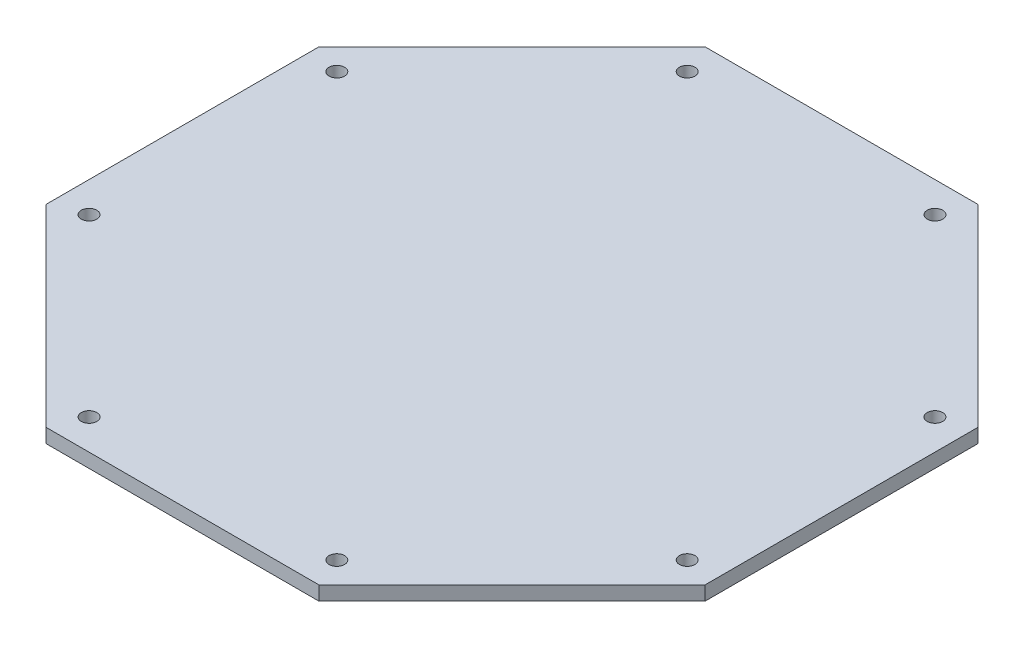
ISO-10303-21;
HEADER;
FILE_DESCRIPTION(('STEP AP214'),'2;1');
FILE_NAME('part.step','',(''),(''),'','','');
FILE_SCHEMA(('AUTOMOTIVE_DESIGN { 1 0 10303 214 1 1 1 1 }'));
ENDSEC;
DATA;
#1=APPLICATION_CONTEXT('core data for automotive mechanical design processes');
#2=APPLICATION_PROTOCOL_DEFINITION('international standard','automotive_design',2000,#1);
#3=PRODUCT_CONTEXT('',#1,'mechanical');
#4=PRODUCT('Part','Part','',(#3));
#5=PRODUCT_RELATED_PRODUCT_CATEGORY('part','',(#4));
#6=PRODUCT_DEFINITION_FORMATION('','',#4);
#7=PRODUCT_DEFINITION_CONTEXT('part definition',#1,'design');
#8=PRODUCT_DEFINITION('design','',#6,#7);
#9=PRODUCT_DEFINITION_SHAPE('','',#8);
#10=(LENGTH_UNIT() NAMED_UNIT(*) SI_UNIT(.MILLI.,.METRE.));
#11=(NAMED_UNIT(*) PLANE_ANGLE_UNIT() SI_UNIT($,.RADIAN.));
#12=(NAMED_UNIT(*) SI_UNIT($,.STERADIAN.) SOLID_ANGLE_UNIT());
#13=UNCERTAINTY_MEASURE_WITH_UNIT(LENGTH_MEASURE(1.E-05),#10,'distance_accuracy_value','');
#14=(GEOMETRIC_REPRESENTATION_CONTEXT(3) GLOBAL_UNCERTAINTY_ASSIGNED_CONTEXT((#13)) GLOBAL_UNIT_ASSIGNED_CONTEXT((#10,
#11,#12)) REPRESENTATION_CONTEXT('',''));
#15=CARTESIAN_POINT('',(0.,0.,0.));
#16=DIRECTION('',(0.,0.,1.));
#17=DIRECTION('',(1.,0.,0.));
#18=AXIS2_PLACEMENT_3D('',#15,#16,#17);
#19=CARTESIAN_POINT('',(70.,1.5,28.9949493661166));
#20=DIRECTION('',(-1.,0.,0.));
#21=DIRECTION('',(0.,0.,1.));
#22=AXIS2_PLACEMENT_3D('',#19,#20,#21);
#23=PLANE('',#22);
#24=DIRECTION('',(0.,0.,-1.));
#25=VECTOR('',#24,1.);
#26=CARTESIAN_POINT('',(70.,-1.5,28.9949493661166));
#27=LINE('',#26,#25);
#28=CARTESIAN_POINT('',(70.,-1.5,28.9949493661166));
#29=VERTEX_POINT('',#28);
#30=CARTESIAN_POINT('',(70.,-1.5,-28.9949493661166));
#31=VERTEX_POINT('',#30);
#32=EDGE_CURVE('E139',#29,#31,#27,.T.);
#33=ORIENTED_EDGE('',*,*,#32,.T.);
#34=DIRECTION('',(0.,-1.,0.));
#35=VECTOR('',#34,1.);
#36=CARTESIAN_POINT('',(70.,1.5,-28.9949493661166));
#37=LINE('',#36,#35);
#38=CARTESIAN_POINT('',(70.,1.5,-28.9949493661166));
#39=VERTEX_POINT('',#38);
#40=EDGE_CURVE('E11',#39,#31,#37,.T.);
#41=ORIENTED_EDGE('',*,*,#40,.F.);
#42=DIRECTION('',(0.,0.,-1.));
#43=VECTOR('',#42,1.);
#44=CARTESIAN_POINT('',(70.,1.5,28.9949493661166));
#45=LINE('',#44,#43);
#46=CARTESIAN_POINT('',(70.,1.5,28.9949493661166));
#47=VERTEX_POINT('',#46);
#48=EDGE_CURVE('E154',#47,#39,#45,.T.);
#49=ORIENTED_EDGE('',*,*,#48,.F.);
#50=DIRECTION('',(0.,-1.,0.));
#51=VECTOR('',#50,1.);
#52=CARTESIAN_POINT('',(70.,1.5,28.9949493661166));
#53=LINE('',#52,#51);
#54=EDGE_CURVE('E135',#47,#29,#53,.T.);
#55=ORIENTED_EDGE('',*,*,#54,.T.);
#56=EDGE_LOOP('',(#33,#41,#49,#55));
#57=FACE_BOUND('',#56,.T.);
#58=ADVANCED_FACE('F43',(#57),#23,.F.);
#59=CARTESIAN_POINT('',(70.,1.5,-28.9949493661166));
#60=DIRECTION('',(-0.707106781186547,0.,0.707106781186547));
#61=DIRECTION('',(0.707106781186548,0.,0.707106781186548));
#62=AXIS2_PLACEMENT_3D('',#59,#60,#61);
#63=PLANE('',#62);
#64=DIRECTION('',(-0.707106781186548,0.,-0.707106781186548));
#65=VECTOR('',#64,1.);
#66=CARTESIAN_POINT('',(70.,-1.5,-28.9949493661166));
#67=LINE('',#66,#65);
#68=CARTESIAN_POINT('',(28.9949493661166,-1.5,-70.));
#69=VERTEX_POINT('',#68);
#70=EDGE_CURVE('E142',#31,#69,#67,.T.);
#71=ORIENTED_EDGE('',*,*,#70,.T.);
#72=DIRECTION('',(0.,-1.,0.));
#73=VECTOR('',#72,1.);
#74=CARTESIAN_POINT('',(28.9949493661166,1.5,-70.));
#75=LINE('',#74,#73);
#76=CARTESIAN_POINT('',(28.9949493661166,1.5,-70.));
#77=VERTEX_POINT('',#76);
#78=EDGE_CURVE('E51',#77,#69,#75,.T.);
#79=ORIENTED_EDGE('',*,*,#78,.F.);
#80=DIRECTION('',(-0.707106781186548,0.,-0.707106781186548));
#81=VECTOR('',#80,1.);
#82=CARTESIAN_POINT('',(70.,1.5,-28.9949493661166));
#83=LINE('',#82,#81);
#84=EDGE_CURVE('E102',#39,#77,#83,.T.);
#85=ORIENTED_EDGE('',*,*,#84,.F.);
#86=ORIENTED_EDGE('',*,*,#40,.T.);
#87=EDGE_LOOP('',(#71,#79,#85,#86));
#88=FACE_BOUND('',#87,.T.);
#89=ADVANCED_FACE('F257',(#88),#63,.F.);
#90=CARTESIAN_POINT('',(28.9949493661166,1.5,-70.));
#91=DIRECTION('',(0.,0.,1.));
#92=DIRECTION('',(1.,0.,0.));
#93=AXIS2_PLACEMENT_3D('',#90,#91,#92);
#94=PLANE('',#93);
#95=DIRECTION('',(-1.,0.,0.));
#96=VECTOR('',#95,1.);
#97=CARTESIAN_POINT('',(28.9949493661166,-1.5,-70.));
#98=LINE('',#97,#96);
#99=CARTESIAN_POINT('',(-28.9949493661167,-1.5,-70.));
#100=VERTEX_POINT('',#99);
#101=EDGE_CURVE('E145',#69,#100,#98,.T.);
#102=ORIENTED_EDGE('',*,*,#101,.T.);
#103=DIRECTION('',(0.,-1.,0.));
#104=VECTOR('',#103,1.);
#105=CARTESIAN_POINT('',(-28.9949493661167,1.5,-70.));
#106=LINE('',#105,#104);
#107=CARTESIAN_POINT('',(-28.9949493661167,1.5,-70.));
#108=VERTEX_POINT('',#107);
#109=EDGE_CURVE('E161',#108,#100,#106,.T.);
#110=ORIENTED_EDGE('',*,*,#109,.F.);
#111=DIRECTION('',(-1.,0.,0.));
#112=VECTOR('',#111,1.);
#113=CARTESIAN_POINT('',(28.9949493661166,1.5,-70.));
#114=LINE('',#113,#112);
#115=EDGE_CURVE('E169',#77,#108,#114,.T.);
#116=ORIENTED_EDGE('',*,*,#115,.F.);
#117=ORIENTED_EDGE('',*,*,#78,.T.);
#118=EDGE_LOOP('',(#102,#110,#116,#117));
#119=FACE_BOUND('',#118,.T.);
#120=ADVANCED_FACE('F167',(#119),#94,.F.);
#121=CARTESIAN_POINT('',(-28.9949493661167,1.5,-70.));
#122=DIRECTION('',(0.707106781186547,0.,0.707106781186547));
#123=DIRECTION('',(0.707106781186548,0.,-0.707106781186548));
#124=AXIS2_PLACEMENT_3D('',#121,#122,#123);
#125=PLANE('',#124);
#126=DIRECTION('',(-0.707106781186548,0.,0.707106781186548));
#127=VECTOR('',#126,1.);
#128=CARTESIAN_POINT('',(-28.9949493661167,-1.5,-70.));
#129=LINE('',#128,#127);
#130=CARTESIAN_POINT('',(-70.,-1.5,-28.9949493661166));
#131=VERTEX_POINT('',#130);
#132=EDGE_CURVE('E147',#100,#131,#129,.T.);
#133=ORIENTED_EDGE('',*,*,#132,.T.);
#134=DIRECTION('',(0.,-1.,0.));
#135=VECTOR('',#134,1.);
#136=CARTESIAN_POINT('',(-70.,1.5,-28.9949493661166));
#137=LINE('',#136,#135);
#138=CARTESIAN_POINT('',(-70.,1.5,-28.9949493661166));
#139=VERTEX_POINT('',#138);
#140=EDGE_CURVE('E158',#139,#131,#137,.T.);
#141=ORIENTED_EDGE('',*,*,#140,.F.);
#142=DIRECTION('',(-0.707106781186548,0.,0.707106781186548));
#143=VECTOR('',#142,1.);
#144=CARTESIAN_POINT('',(-28.9949493661167,1.5,-70.));
#145=LINE('',#144,#143);
#146=EDGE_CURVE('E181',#108,#139,#145,.T.);
#147=ORIENTED_EDGE('',*,*,#146,.F.);
#148=ORIENTED_EDGE('',*,*,#109,.T.);
#149=EDGE_LOOP('',(#133,#141,#147,#148));
#150=FACE_BOUND('',#149,.T.);
#151=ADVANCED_FACE('F177',(#150),#125,.F.);
#152=CARTESIAN_POINT('',(-70.,1.5,-28.9949493661166));
#153=DIRECTION('',(1.,0.,0.));
#154=DIRECTION('',(0.,0.,-1.));
#155=AXIS2_PLACEMENT_3D('',#152,#153,#154);
#156=PLANE('',#155);
#157=DIRECTION('',(0.,0.,1.));
#158=VECTOR('',#157,1.);
#159=CARTESIAN_POINT('',(-70.,-1.5,-28.9949493661166));
#160=LINE('',#159,#158);
#161=CARTESIAN_POINT('',(-70.,-1.5,28.9949493661167));
#162=VERTEX_POINT('',#161);
#163=EDGE_CURVE('E149',#131,#162,#160,.T.);
#164=ORIENTED_EDGE('',*,*,#163,.T.);
#165=DIRECTION('',(0.,-1.,0.));
#166=VECTOR('',#165,1.);
#167=CARTESIAN_POINT('',(-70.,1.5,28.9949493661167));
#168=LINE('',#167,#166);
#169=CARTESIAN_POINT('',(-70.,1.5,28.9949493661167));
#170=VERTEX_POINT('',#169);
#171=EDGE_CURVE('E130',#170,#162,#168,.T.);
#172=ORIENTED_EDGE('',*,*,#171,.F.);
#173=DIRECTION('',(0.,0.,1.));
#174=VECTOR('',#173,1.);
#175=CARTESIAN_POINT('',(-70.,1.5,-28.9949493661166));
#176=LINE('',#175,#174);
#177=EDGE_CURVE('E121',#139,#170,#176,.T.);
#178=ORIENTED_EDGE('',*,*,#177,.F.);
#179=ORIENTED_EDGE('',*,*,#140,.T.);
#180=EDGE_LOOP('',(#164,#172,#178,#179));
#181=FACE_BOUND('',#180,.T.);
#182=ADVANCED_FACE('F180',(#181),#156,.F.);
#183=CARTESIAN_POINT('',(-70.,1.5,28.9949493661167));
#184=DIRECTION('',(0.707106781186547,0.,-0.707106781186548));
#185=DIRECTION('',(-0.707106781186548,0.,-0.707106781186547));
#186=AXIS2_PLACEMENT_3D('',#183,#184,#185);
#187=PLANE('',#186);
#188=DIRECTION('',(0.707106781186548,0.,0.707106781186547));
#189=VECTOR('',#188,1.);
#190=CARTESIAN_POINT('',(-70.,-1.5,28.9949493661167));
#191=LINE('',#190,#189);
#192=CARTESIAN_POINT('',(-28.9949493661167,-1.5,70.));
#193=VERTEX_POINT('',#192);
#194=EDGE_CURVE('E129',#162,#193,#191,.T.);
#195=ORIENTED_EDGE('',*,*,#194,.T.);
#196=DIRECTION('',(0.,-1.,0.));
#197=VECTOR('',#196,1.);
#198=CARTESIAN_POINT('',(-28.9949493661167,1.5,70.));
#199=LINE('',#198,#197);
#200=CARTESIAN_POINT('',(-28.9949493661167,1.5,70.));
#201=VERTEX_POINT('',#200);
#202=EDGE_CURVE('E126',#201,#193,#199,.T.);
#203=ORIENTED_EDGE('',*,*,#202,.F.);
#204=DIRECTION('',(0.707106781186548,0.,0.707106781186547));
#205=VECTOR('',#204,1.);
#206=CARTESIAN_POINT('',(-70.,1.5,28.9949493661167));
#207=LINE('',#206,#205);
#208=EDGE_CURVE('E115',#170,#201,#207,.T.);
#209=ORIENTED_EDGE('',*,*,#208,.F.);
#210=ORIENTED_EDGE('',*,*,#171,.T.);
#211=EDGE_LOOP('',(#195,#203,#209,#210));
#212=FACE_BOUND('',#211,.T.);
#213=ADVANCED_FACE('F127',(#212),#187,.F.);
#214=CARTESIAN_POINT('',(-28.9949493661167,1.5,70.));
#215=DIRECTION('',(0.,0.,-1.));
#216=DIRECTION('',(-1.,0.,0.));
#217=AXIS2_PLACEMENT_3D('',#214,#215,#216);
#218=PLANE('',#217);
#219=DIRECTION('',(1.,0.,0.));
#220=VECTOR('',#219,1.);
#221=CARTESIAN_POINT('',(-28.9949493661167,-1.5,70.));
#222=LINE('',#221,#220);
#223=CARTESIAN_POINT('',(28.9949493661166,-1.5,70.));
#224=VERTEX_POINT('',#223);
#225=EDGE_CURVE('E88',#193,#224,#222,.T.);
#226=ORIENTED_EDGE('',*,*,#225,.T.);
#227=DIRECTION('',(0.,-1.,0.));
#228=VECTOR('',#227,1.);
#229=CARTESIAN_POINT('',(28.9949493661166,1.5,70.));
#230=LINE('',#229,#228);
#231=CARTESIAN_POINT('',(28.9949493661166,1.5,70.));
#232=VERTEX_POINT('',#231);
#233=EDGE_CURVE('E131',#232,#224,#230,.T.);
#234=ORIENTED_EDGE('',*,*,#233,.F.);
#235=DIRECTION('',(1.,0.,0.));
#236=VECTOR('',#235,1.);
#237=CARTESIAN_POINT('',(-28.9949493661167,1.5,70.));
#238=LINE('',#237,#236);
#239=EDGE_CURVE('E119',#201,#232,#238,.T.);
#240=ORIENTED_EDGE('',*,*,#239,.F.);
#241=ORIENTED_EDGE('',*,*,#202,.T.);
#242=EDGE_LOOP('',(#226,#234,#240,#241));
#243=FACE_BOUND('',#242,.T.);
#244=ADVANCED_FACE('F133',(#243),#218,.F.);
#245=CARTESIAN_POINT('',(28.9949493661166,1.5,70.));
#246=DIRECTION('',(-0.707106781186547,0.,-0.707106781186548));
#247=DIRECTION('',(-0.707106781186548,0.,0.707106781186547));
#248=AXIS2_PLACEMENT_3D('',#245,#246,#247);
#249=PLANE('',#248);
#250=DIRECTION('',(0.707106781186548,0.,-0.707106781186547));
#251=VECTOR('',#250,1.);
#252=CARTESIAN_POINT('',(28.9949493661166,-1.5,70.));
#253=LINE('',#252,#251);
#254=EDGE_CURVE('E94',#224,#29,#253,.T.);
#255=ORIENTED_EDGE('',*,*,#254,.T.);
#256=ORIENTED_EDGE('',*,*,#54,.F.);
#257=DIRECTION('',(0.707106781186548,0.,-0.707106781186547));
#258=VECTOR('',#257,1.);
#259=CARTESIAN_POINT('',(28.9949493661166,1.5,70.));
#260=LINE('',#259,#258);
#261=EDGE_CURVE('E59',#232,#47,#260,.T.);
#262=ORIENTED_EDGE('',*,*,#261,.F.);
#263=ORIENTED_EDGE('',*,*,#233,.T.);
#264=EDGE_LOOP('',(#255,#256,#262,#263));
#265=FACE_BOUND('',#264,.T.);
#266=ADVANCED_FACE('F264',(#265),#249,.F.);
#267=CARTESIAN_POINT('',(0.,1.5,0.));
#268=DIRECTION('',(0.,1.,0.));
#269=DIRECTION('',(0.,0.,1.));
#270=AXIS2_PLACEMENT_3D('',#267,#268,#269);
#271=PLANE('',#270);
#272=CARTESIAN_POINT('',(-26.316165339561,1.5,-63.532843272421));
#273=DIRECTION('',(0.,-1.,0.));
#274=DIRECTION('',(0.,0.,-1.));
#275=AXIS2_PLACEMENT_3D('',#272,#273,#274);
#276=CIRCLE('',#275,1.64999999999999);
#277=CARTESIAN_POINT('',(-26.316165339561,1.5,-65.182843272421));
#278=VERTEX_POINT('',#277);
#279=EDGE_CURVE('E200',#278,#278,#276,.T.);
#280=ORIENTED_EDGE('',*,*,#279,.T.);
#281=EDGE_LOOP('',(#280));
#282=FACE_BOUND('',#281,.T.);
#283=CARTESIAN_POINT('',(-63.532843272421,1.5,26.316165339561));
#284=DIRECTION('',(0.,-1.,0.));
#285=DIRECTION('',(0.,0.,-1.));
#286=AXIS2_PLACEMENT_3D('',#283,#284,#285);
#287=CIRCLE('',#286,1.65);
#288=CARTESIAN_POINT('',(-63.532843272421,1.5,24.666165339561));
#289=VERTEX_POINT('',#288);
#290=EDGE_CURVE('E193',#289,#289,#287,.T.);
#291=ORIENTED_EDGE('',*,*,#290,.T.);
#292=EDGE_LOOP('',(#291));
#293=FACE_BOUND('',#292,.T.);
#294=CARTESIAN_POINT('',(-63.532843272421,1.5,-26.316165339561));
#295=DIRECTION('',(0.,-1.,0.));
#296=DIRECTION('',(0.,0.,-1.));
#297=AXIS2_PLACEMENT_3D('',#294,#295,#296);
#298=CIRCLE('',#297,1.65);
#299=CARTESIAN_POINT('',(-63.532843272421,1.5,-27.966165339561));
#300=VERTEX_POINT('',#299);
#301=EDGE_CURVE('E207',#300,#300,#298,.T.);
#302=ORIENTED_EDGE('',*,*,#301,.T.);
#303=EDGE_LOOP('',(#302));
#304=FACE_BOUND('',#303,.T.);
#305=CARTESIAN_POINT('',(26.3161653395609,1.5,-63.532843272421));
#306=DIRECTION('',(0.,-1.,0.));
#307=DIRECTION('',(0.,0.,-1.));
#308=AXIS2_PLACEMENT_3D('',#305,#306,#307);
#309=CIRCLE('',#308,1.65);
#310=CARTESIAN_POINT('',(26.3161653395609,1.5,-65.182843272421));
#311=VERTEX_POINT('',#310);
#312=EDGE_CURVE('E206',#311,#311,#309,.T.);
#313=ORIENTED_EDGE('',*,*,#312,.T.);
#314=EDGE_LOOP('',(#313));
#315=FACE_BOUND('',#314,.T.);
#316=CARTESIAN_POINT('',(63.532843272421,1.5,-26.316165339561));
#317=DIRECTION('',(0.,-1.,0.));
#318=DIRECTION('',(0.,0.,-1.));
#319=AXIS2_PLACEMENT_3D('',#316,#317,#318);
#320=CIRCLE('',#319,1.65);
#321=CARTESIAN_POINT('',(63.532843272421,1.5,-27.9661653395611));
#322=VERTEX_POINT('',#321);
#323=EDGE_CURVE('E217',#322,#322,#320,.T.);
#324=ORIENTED_EDGE('',*,*,#323,.T.);
#325=EDGE_LOOP('',(#324));
#326=FACE_BOUND('',#325,.T.);
#327=CARTESIAN_POINT('',(63.532843272421,1.5,26.316165339561));
#328=DIRECTION('',(0.,-1.,0.));
#329=DIRECTION('',(0.,0.,-1.));
#330=AXIS2_PLACEMENT_3D('',#327,#328,#329);
#331=CIRCLE('',#330,1.65000000000001);
#332=CARTESIAN_POINT('',(63.532843272421,1.5,24.666165339561));
#333=VERTEX_POINT('',#332);
#334=EDGE_CURVE('E223',#333,#333,#331,.T.);
#335=ORIENTED_EDGE('',*,*,#334,.T.);
#336=EDGE_LOOP('',(#335));
#337=FACE_BOUND('',#336,.T.);
#338=CARTESIAN_POINT('',(26.316165339561,1.5,63.532843272421));
#339=DIRECTION('',(0.,-1.,0.));
#340=DIRECTION('',(0.,0.,-1.));
#341=AXIS2_PLACEMENT_3D('',#338,#339,#340);
#342=CIRCLE('',#341,1.65);
#343=CARTESIAN_POINT('',(26.316165339561,1.5,61.882843272421));
#344=VERTEX_POINT('',#343);
#345=EDGE_CURVE('E229',#344,#344,#342,.T.);
#346=ORIENTED_EDGE('',*,*,#345,.T.);
#347=EDGE_LOOP('',(#346));
#348=FACE_BOUND('',#347,.T.);
#349=CARTESIAN_POINT('',(-26.316165339561,1.5,63.532843272421));
#350=DIRECTION('',(0.,-1.,0.));
#351=DIRECTION('',(0.,0.,-1.));
#352=AXIS2_PLACEMENT_3D('',#349,#350,#351);
#353=CIRCLE('',#352,1.65);
#354=CARTESIAN_POINT('',(-26.316165339561,1.5,61.882843272421));
#355=VERTEX_POINT('',#354);
#356=EDGE_CURVE('E143',#355,#355,#353,.T.);
#357=ORIENTED_EDGE('',*,*,#356,.T.);
#358=EDGE_LOOP('',(#357));
#359=FACE_BOUND('',#358,.T.);
#360=ORIENTED_EDGE('',*,*,#48,.T.);
#361=ORIENTED_EDGE('',*,*,#84,.T.);
#362=ORIENTED_EDGE('',*,*,#115,.T.);
#363=ORIENTED_EDGE('',*,*,#146,.T.);
#364=ORIENTED_EDGE('',*,*,#177,.T.);
#365=ORIENTED_EDGE('',*,*,#208,.T.);
#366=ORIENTED_EDGE('',*,*,#239,.T.);
#367=ORIENTED_EDGE('',*,*,#261,.T.);
#368=EDGE_LOOP('',(#360,#361,#362,#363,#364,#365,#366,#367));
#369=FACE_BOUND('',#368,.T.);
#370=ADVANCED_FACE('F117',(#282,#293,#304,#315,#326,#337,#348,#359,#369),#271,.T.);
#371=CARTESIAN_POINT('',(0.,-1.5,0.));
#372=DIRECTION('',(0.,1.,0.));
#373=DIRECTION('',(0.,0.,1.));
#374=AXIS2_PLACEMENT_3D('',#371,#372,#373);
#375=PLANE('',#374);
#376=CARTESIAN_POINT('',(-26.316165339561,-1.5,-63.532843272421));
#377=DIRECTION('',(0.,-1.,0.));
#378=DIRECTION('',(0.,0.,-1.));
#379=AXIS2_PLACEMENT_3D('',#376,#377,#378);
#380=CIRCLE('',#379,1.64999999999999);
#381=CARTESIAN_POINT('',(-26.316165339561,-1.5,-65.182843272421));
#382=VERTEX_POINT('',#381);
#383=EDGE_CURVE('E203',#382,#382,#380,.T.);
#384=ORIENTED_EDGE('',*,*,#383,.F.);
#385=EDGE_LOOP('',(#384));
#386=FACE_BOUND('',#385,.T.);
#387=CARTESIAN_POINT('',(-63.532843272421,-1.5,26.316165339561));
#388=DIRECTION('',(0.,-1.,0.));
#389=DIRECTION('',(0.,0.,-1.));
#390=AXIS2_PLACEMENT_3D('',#387,#388,#389);
#391=CIRCLE('',#390,1.65);
#392=CARTESIAN_POINT('',(-63.532843272421,-1.5,24.666165339561));
#393=VERTEX_POINT('',#392);
#394=EDGE_CURVE('E196',#393,#393,#391,.T.);
#395=ORIENTED_EDGE('',*,*,#394,.F.);
#396=EDGE_LOOP('',(#395));
#397=FACE_BOUND('',#396,.T.);
#398=CARTESIAN_POINT('',(-63.532843272421,-1.5,-26.316165339561));
#399=DIRECTION('',(0.,-1.,0.));
#400=DIRECTION('',(0.,0.,-1.));
#401=AXIS2_PLACEMENT_3D('',#398,#399,#400);
#402=CIRCLE('',#401,1.65);
#403=CARTESIAN_POINT('',(-63.532843272421,-1.5,-27.966165339561));
#404=VERTEX_POINT('',#403);
#405=EDGE_CURVE('E197',#404,#404,#402,.T.);
#406=ORIENTED_EDGE('',*,*,#405,.F.);
#407=EDGE_LOOP('',(#406));
#408=FACE_BOUND('',#407,.T.);
#409=CARTESIAN_POINT('',(26.3161653395609,-1.5,-63.532843272421));
#410=DIRECTION('',(0.,-1.,0.));
#411=DIRECTION('',(0.,0.,-1.));
#412=AXIS2_PLACEMENT_3D('',#409,#410,#411);
#413=CIRCLE('',#412,1.65);
#414=CARTESIAN_POINT('',(26.3161653395609,-1.5,-65.182843272421));
#415=VERTEX_POINT('',#414);
#416=EDGE_CURVE('E214',#415,#415,#413,.T.);
#417=ORIENTED_EDGE('',*,*,#416,.F.);
#418=EDGE_LOOP('',(#417));
#419=FACE_BOUND('',#418,.T.);
#420=CARTESIAN_POINT('',(63.532843272421,-1.5,-26.316165339561));
#421=DIRECTION('',(0.,-1.,0.));
#422=DIRECTION('',(0.,0.,-1.));
#423=AXIS2_PLACEMENT_3D('',#420,#421,#422);
#424=CIRCLE('',#423,1.65);
#425=CARTESIAN_POINT('',(63.532843272421,-1.5,-27.9661653395611));
#426=VERTEX_POINT('',#425);
#427=EDGE_CURVE('E220',#426,#426,#424,.T.);
#428=ORIENTED_EDGE('',*,*,#427,.F.);
#429=EDGE_LOOP('',(#428));
#430=FACE_BOUND('',#429,.T.);
#431=CARTESIAN_POINT('',(63.532843272421,-1.5,26.316165339561));
#432=DIRECTION('',(0.,-1.,0.));
#433=DIRECTION('',(0.,0.,-1.));
#434=AXIS2_PLACEMENT_3D('',#431,#432,#433);
#435=CIRCLE('',#434,1.65000000000001);
#436=CARTESIAN_POINT('',(63.532843272421,-1.5,24.666165339561));
#437=VERTEX_POINT('',#436);
#438=EDGE_CURVE('E226',#437,#437,#435,.T.);
#439=ORIENTED_EDGE('',*,*,#438,.F.);
#440=EDGE_LOOP('',(#439));
#441=FACE_BOUND('',#440,.T.);
#442=CARTESIAN_POINT('',(26.316165339561,-1.5,63.532843272421));
#443=DIRECTION('',(0.,-1.,0.));
#444=DIRECTION('',(0.,0.,-1.));
#445=AXIS2_PLACEMENT_3D('',#442,#443,#444);
#446=CIRCLE('',#445,1.65);
#447=CARTESIAN_POINT('',(26.316165339561,-1.5,61.882843272421));
#448=VERTEX_POINT('',#447);
#449=EDGE_CURVE('E190',#448,#448,#446,.T.);
#450=ORIENTED_EDGE('',*,*,#449,.F.);
#451=EDGE_LOOP('',(#450));
#452=FACE_BOUND('',#451,.T.);
#453=CARTESIAN_POINT('',(-26.316165339561,-1.5,63.532843272421));
#454=DIRECTION('',(0.,-1.,0.));
#455=DIRECTION('',(0.,0.,-1.));
#456=AXIS2_PLACEMENT_3D('',#453,#454,#455);
#457=CIRCLE('',#456,1.65);
#458=CARTESIAN_POINT('',(-26.316165339561,-1.5,61.882843272421));
#459=VERTEX_POINT('',#458);
#460=EDGE_CURVE('E187',#459,#459,#457,.T.);
#461=ORIENTED_EDGE('',*,*,#460,.F.);
#462=EDGE_LOOP('',(#461));
#463=FACE_BOUND('',#462,.T.);
#464=ORIENTED_EDGE('',*,*,#32,.F.);
#465=ORIENTED_EDGE('',*,*,#254,.F.);
#466=ORIENTED_EDGE('',*,*,#225,.F.);
#467=ORIENTED_EDGE('',*,*,#194,.F.);
#468=ORIENTED_EDGE('',*,*,#163,.F.);
#469=ORIENTED_EDGE('',*,*,#132,.F.);
#470=ORIENTED_EDGE('',*,*,#101,.F.);
#471=ORIENTED_EDGE('',*,*,#70,.F.);
#472=EDGE_LOOP('',(#464,#465,#466,#467,#468,#469,#470,#471));
#473=FACE_BOUND('',#472,.T.);
#474=ADVANCED_FACE('F173',(#386,#397,#408,#419,#430,#441,#452,#463,#473),#375,.F.);
#475=CARTESIAN_POINT('',(-26.316165339561,1.5,63.532843272421));
#476=DIRECTION('',(0.,-1.,0.));
#477=DIRECTION('',(0.,0.,-1.));
#478=AXIS2_PLACEMENT_3D('',#475,#476,#477);
#479=CYLINDRICAL_SURFACE('',#478,1.65);
#480=ORIENTED_EDGE('',*,*,#356,.F.);
#481=EDGE_LOOP('',(#480));
#482=FACE_BOUND('',#481,.T.);
#483=ORIENTED_EDGE('',*,*,#460,.T.);
#484=EDGE_LOOP('',(#483));
#485=FACE_BOUND('',#484,.T.);
#486=ADVANCED_FACE('F239',(#482,#485),#479,.F.);
#487=CARTESIAN_POINT('',(26.316165339561,1.5,63.532843272421));
#488=DIRECTION('',(0.,-1.,0.));
#489=DIRECTION('',(0.,0.,-1.));
#490=AXIS2_PLACEMENT_3D('',#487,#488,#489);
#491=CYLINDRICAL_SURFACE('',#490,1.65);
#492=ORIENTED_EDGE('',*,*,#345,.F.);
#493=EDGE_LOOP('',(#492));
#494=FACE_BOUND('',#493,.T.);
#495=ORIENTED_EDGE('',*,*,#449,.T.);
#496=EDGE_LOOP('',(#495));
#497=FACE_BOUND('',#496,.T.);
#498=ADVANCED_FACE('F235',(#494,#497),#491,.F.);
#499=CARTESIAN_POINT('',(63.532843272421,1.5,26.316165339561));
#500=DIRECTION('',(0.,-1.,0.));
#501=DIRECTION('',(0.,0.,-1.));
#502=AXIS2_PLACEMENT_3D('',#499,#500,#501);
#503=CYLINDRICAL_SURFACE('',#502,1.65000000000001);
#504=ORIENTED_EDGE('',*,*,#334,.F.);
#505=EDGE_LOOP('',(#504));
#506=FACE_BOUND('',#505,.T.);
#507=ORIENTED_EDGE('',*,*,#438,.T.);
#508=EDGE_LOOP('',(#507));
#509=FACE_BOUND('',#508,.T.);
#510=ADVANCED_FACE('F250',(#506,#509),#503,.F.);
#511=CARTESIAN_POINT('',(63.532843272421,1.5,-26.316165339561));
#512=DIRECTION('',(0.,-1.,0.));
#513=DIRECTION('',(0.,0.,-1.));
#514=AXIS2_PLACEMENT_3D('',#511,#512,#513);
#515=CYLINDRICAL_SURFACE('',#514,1.65);
#516=ORIENTED_EDGE('',*,*,#323,.F.);
#517=EDGE_LOOP('',(#516));
#518=FACE_BOUND('',#517,.T.);
#519=ORIENTED_EDGE('',*,*,#427,.T.);
#520=EDGE_LOOP('',(#519));
#521=FACE_BOUND('',#520,.T.);
#522=ADVANCED_FACE('F341',(#518,#521),#515,.F.);
#523=CARTESIAN_POINT('',(26.3161653395609,1.5,-63.532843272421));
#524=DIRECTION('',(0.,-1.,0.));
#525=DIRECTION('',(0.,0.,-1.));
#526=AXIS2_PLACEMENT_3D('',#523,#524,#525);
#527=CYLINDRICAL_SURFACE('',#526,1.65);
#528=ORIENTED_EDGE('',*,*,#312,.F.);
#529=EDGE_LOOP('',(#528));
#530=FACE_BOUND('',#529,.T.);
#531=ORIENTED_EDGE('',*,*,#416,.T.);
#532=EDGE_LOOP('',(#531));
#533=FACE_BOUND('',#532,.T.);
#534=ADVANCED_FACE('F351',(#530,#533),#527,.F.);
#535=CARTESIAN_POINT('',(-63.532843272421,1.5,-26.316165339561));
#536=DIRECTION('',(0.,-1.,0.));
#537=DIRECTION('',(0.,0.,-1.));
#538=AXIS2_PLACEMENT_3D('',#535,#536,#537);
#539=CYLINDRICAL_SURFACE('',#538,1.65);
#540=ORIENTED_EDGE('',*,*,#301,.F.);
#541=EDGE_LOOP('',(#540));
#542=FACE_BOUND('',#541,.T.);
#543=ORIENTED_EDGE('',*,*,#405,.T.);
#544=EDGE_LOOP('',(#543));
#545=FACE_BOUND('',#544,.T.);
#546=ADVANCED_FACE('F361',(#542,#545),#539,.F.);
#547=CARTESIAN_POINT('',(-63.532843272421,1.5,26.316165339561));
#548=DIRECTION('',(0.,-1.,0.));
#549=DIRECTION('',(0.,0.,-1.));
#550=AXIS2_PLACEMENT_3D('',#547,#548,#549);
#551=CYLINDRICAL_SURFACE('',#550,1.65);
#552=ORIENTED_EDGE('',*,*,#290,.F.);
#553=EDGE_LOOP('',(#552));
#554=FACE_BOUND('',#553,.T.);
#555=ORIENTED_EDGE('',*,*,#394,.T.);
#556=EDGE_LOOP('',(#555));
#557=FACE_BOUND('',#556,.T.);
#558=ADVANCED_FACE('F371',(#554,#557),#551,.F.);
#559=CARTESIAN_POINT('',(-26.316165339561,1.5,-63.532843272421));
#560=DIRECTION('',(0.,-1.,0.));
#561=DIRECTION('',(0.,0.,-1.));
#562=AXIS2_PLACEMENT_3D('',#559,#560,#561);
#563=CYLINDRICAL_SURFACE('',#562,1.64999999999999);
#564=ORIENTED_EDGE('',*,*,#279,.F.);
#565=EDGE_LOOP('',(#564));
#566=FACE_BOUND('',#565,.T.);
#567=ORIENTED_EDGE('',*,*,#383,.T.);
#568=EDGE_LOOP('',(#567));
#569=FACE_BOUND('',#568,.T.);
#570=ADVANCED_FACE('F381',(#566,#569),#563,.F.);
#571=CLOSED_SHELL('',(#58,#89,#120,#151,#182,#213,#244,#266,#370,#474,#486,#498,#510,#522,#534,
#546,#558,#570));
#572=MANIFOLD_SOLID_BREP('B2',#571);
#573=ADVANCED_BREP_SHAPE_REPRESENTATION('',(#18,#572),#14);
#574=SHAPE_DEFINITION_REPRESENTATION(#9,#573);
ENDSEC;
END-ISO-10303-21;
